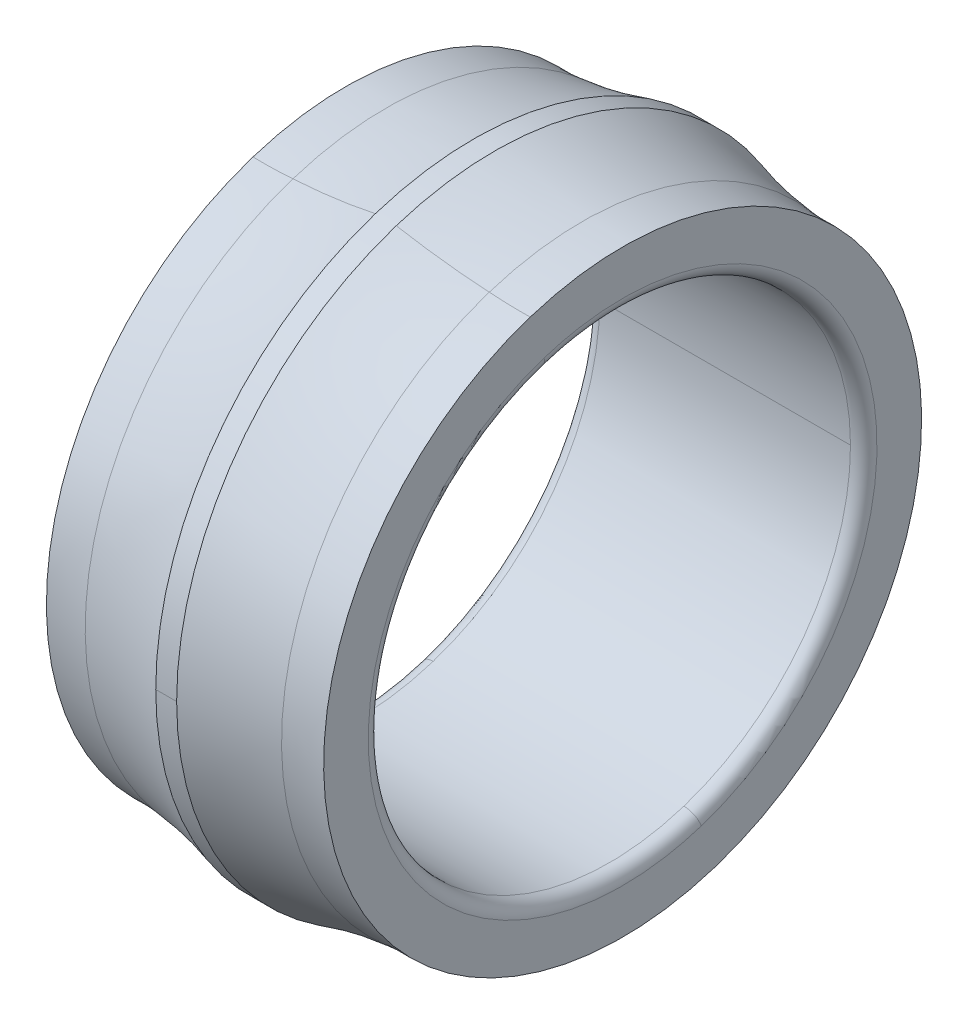
ISO-10303-21;
HEADER;
FILE_DESCRIPTION(('STEP AP214'),'2;1');
FILE_NAME('part.step','',(''),(''),'','','');
FILE_SCHEMA(('AUTOMOTIVE_DESIGN { 1 0 10303 214 1 1 1 1 }'));
ENDSEC;
DATA;
#1=APPLICATION_CONTEXT('core data for automotive mechanical design processes');
#2=APPLICATION_PROTOCOL_DEFINITION('international standard','automotive_design',2000,#1);
#3=PRODUCT_CONTEXT('',#1,'mechanical');
#4=PRODUCT('Part','Part','',(#3));
#5=PRODUCT_RELATED_PRODUCT_CATEGORY('part','',(#4));
#6=PRODUCT_DEFINITION_FORMATION('','',#4);
#7=PRODUCT_DEFINITION_CONTEXT('part definition',#1,'design');
#8=PRODUCT_DEFINITION('design','',#6,#7);
#9=PRODUCT_DEFINITION_SHAPE('','',#8);
#10=(LENGTH_UNIT() NAMED_UNIT(*) SI_UNIT(.MILLI.,.METRE.));
#11=(NAMED_UNIT(*) PLANE_ANGLE_UNIT() SI_UNIT($,.RADIAN.));
#12=(NAMED_UNIT(*) SI_UNIT($,.STERADIAN.) SOLID_ANGLE_UNIT());
#13=UNCERTAINTY_MEASURE_WITH_UNIT(LENGTH_MEASURE(1.E-05),#10,'distance_accuracy_value','');
#14=(GEOMETRIC_REPRESENTATION_CONTEXT(3) GLOBAL_UNCERTAINTY_ASSIGNED_CONTEXT((#13)) GLOBAL_UNIT_ASSIGNED_CONTEXT((#10,
#11,#12)) REPRESENTATION_CONTEXT('',''));
#15=CARTESIAN_POINT('',(0.,0.,0.));
#16=DIRECTION('',(0.,0.,1.));
#17=DIRECTION('',(1.,0.,0.));
#18=AXIS2_PLACEMENT_3D('',#15,#16,#17);
#19=CARTESIAN_POINT('',(0.,24.8,0.));
#20=DIRECTION('',(-1.,0.,0.));
#21=DIRECTION('',(0.,0.,1.));
#22=AXIS2_PLACEMENT_3D('',#19,#20,#21);
#23=PLANE('',#22);
#24=CARTESIAN_POINT('',(0.,0.,0.));
#25=DIRECTION('',(1.,0.,0.));
#26=DIRECTION('',(0.,0.,-1.));
#27=AXIS2_PLACEMENT_3D('',#24,#25,#26);
#28=CIRCLE('',#27,21.1);
#29=CARTESIAN_POINT('',(0.,20.0672924938281,6.5202585813115));
#30=VERTEX_POINT('',#29);
#31=CARTESIAN_POINT('',(0.,-20.0672924938281,-6.52025858131149));
#32=VERTEX_POINT('',#31);
#33=EDGE_CURVE('E10',#30,#32,#28,.T.);
#34=ORIENTED_EDGE('',*,*,#33,.T.);
#35=CARTESIAN_POINT('',(0.,-20.0672924938277,-6.52025858131139));
#36=CARTESIAN_POINT('',(0.,-19.0430510718525,-9.67239202122012));
#37=CARTESIAN_POINT('',(0.,-17.4001446138765,-12.6236072896446));
#38=CARTESIAN_POINT('',(0.,-15.1900988574076,-15.2110989527053));
#39=CARTESIAN_POINT('',(0.,-9.87458804758288,-19.379962845858));
#40=CARTESIAN_POINT('',(0.,-3.37752322544457,-21.2299259970769));
#41=CARTESIAN_POINT('',(0.,0.014850120778391,-21.4969173544922));
#42=CARTESIAN_POINT('',(0.,6.72131360691236,-20.6860762361863));
#43=CARTESIAN_POINT('',(0.,12.6235569906424,-17.4001001484462));
#44=CARTESIAN_POINT('',(0.,15.2111110966231,-15.1901125797661));
#45=CARTESIAN_POINT('',(0.,19.3799658937177,-9.87458206582148));
#46=CARTESIAN_POINT('',(0.,21.2299077574398,-3.37752146660871));
#47=CARTESIAN_POINT('',(0.,21.4969828927928,0.0148355641550033));
#48=CARTESIAN_POINT('',(0.,21.0914413263433,3.36809505726355));
#49=CARTESIAN_POINT('',(0.,20.0672924938277,6.52025858131138));
#50=B_SPLINE_CURVE_WITH_KNOTS('',5,(#35,#36,#37,#38,#39,#40,#41,#42,#43,#44,#45,#46,#47,#48,
#49),.UNSPECIFIED.,.F.,.F.,(6,3,3,3,6),(0.,0.785398163397448,1.5707963267949,2.35619449019234,
3.14159265358979),.UNSPECIFIED.);
#51=EDGE_CURVE('E25',#32,#30,#50,.T.);
#52=ORIENTED_EDGE('',*,*,#51,.T.);
#53=EDGE_LOOP('',(#34,#52));
#54=FACE_BOUND('',#53,.T.);
#55=CARTESIAN_POINT('',(0.,0.,0.));
#56=DIRECTION('',(1.,0.,0.));
#57=DIRECTION('',(0.,0.,-1.));
#58=AXIS2_PLACEMENT_3D('',#55,#56,#57);
#59=CIRCLE('',#58,24.8);
#60=CARTESIAN_POINT('',(0.,23.5862016041198,7.66362146049869));
#61=VERTEX_POINT('',#60);
#62=CARTESIAN_POINT('',(0.,-23.5862016041198,-7.66362146049868));
#63=VERTEX_POINT('',#62);
#64=EDGE_CURVE('E367',#61,#63,#59,.T.);
#65=ORIENTED_EDGE('',*,*,#64,.F.);
#66=CARTESIAN_POINT('',(0.,0.,0.));
#67=DIRECTION('',(1.,0.,0.));
#68=DIRECTION('',(0.,-0.951056516295154,-0.309016994374947));
#69=AXIS2_PLACEMENT_3D('',#66,#67,#68);
#70=CIRCLE('',#69,24.8);
#71=EDGE_CURVE('E362',#63,#61,#70,.T.);
#72=ORIENTED_EDGE('',*,*,#71,.F.);
#73=EDGE_LOOP('',(#65,#72));
#74=FACE_BOUND('',#73,.T.);
#75=ADVANCED_FACE('F16',(#54,#74),#23,.T.);
#76=CARTESIAN_POINT('',(0.736800182850417,0.,0.));
#77=DIRECTION('',(1.,0.,0.));
#78=DIRECTION('',(0.,-0.309016994374947,0.951056516295154));
#79=AXIS2_PLACEMENT_3D('',#76,#77,#78);
#80=TOROIDAL_SURFACE('',#79,47.7881953507417,22.9999999998546);
#81=CARTESIAN_POINT('',(0.736800182850417,-45.4492745903087,-14.767364493889));
#82=DIRECTION('',(0.,0.309016994374947,-0.951056516295154));
#83=DIRECTION('',(-0.0320347905589147,0.950568390709873,0.308858392758054));
#84=AXIS2_PLACEMENT_3D('',#81,#82,#83);
#85=CIRCLE('',#84,22.9999999998546);
#86=CARTESIAN_POINT('',(3.35748315173578,-23.7174350584134,-7.70626179460336));
#87=VERTEX_POINT('',#86);
#88=EDGE_CURVE('E357',#63,#87,#85,.T.);
#89=ORIENTED_EDGE('',*,*,#88,.F.);
#90=ORIENTED_EDGE('',*,*,#71,.T.);
#91=CARTESIAN_POINT('',(0.736800182850417,45.4492745903087,14.767364493889));
#92=DIRECTION('',(0.,-0.309016994374947,0.951056516295154));
#93=DIRECTION('',(-0.0320347905589151,-0.950568390709873,-0.308858392758054));
#94=AXIS2_PLACEMENT_3D('',#91,#92,#93);
#95=CIRCLE('',#94,22.9999999998546);
#96=CARTESIAN_POINT('',(3.35748315173578,23.7174350584134,7.70626179460336));
#97=VERTEX_POINT('',#96);
#98=EDGE_CURVE('E353',#61,#97,#95,.T.);
#99=ORIENTED_EDGE('',*,*,#98,.T.);
#100=CARTESIAN_POINT('',(3.35748315173571,0.,0.));
#101=DIRECTION('',(1.,0.,0.));
#102=DIRECTION('',(0.,-0.951056516295154,-0.309016994374947));
#103=AXIS2_PLACEMENT_3D('',#100,#101,#102);
#104=CIRCLE('',#103,24.937987019746);
#105=EDGE_CURVE('E348',#87,#97,#104,.T.);
#106=ORIENTED_EDGE('',*,*,#105,.F.);
#107=EDGE_LOOP('',(#89,#90,#99,#106));
#108=FACE_BOUND('',#107,.T.);
#109=ADVANCED_FACE('F388',(#108),#80,.F.);
#110=CARTESIAN_POINT('',(0.122239074494067,0.,0.));
#111=DIRECTION('',(1.,0.,0.));
#112=DIRECTION('',(0.,-0.309016994374947,0.951056516295154));
#113=AXIS2_PLACEMENT_3D('',#110,#111,#112);
#114=TOROIDAL_SURFACE('',#113,60.7616960127302,35.9695000000465);
#115=CARTESIAN_POINT('',(0.122239074494067,-57.7878069340523,-18.7763966749781));
#116=DIRECTION('',(0.,0.309016994374947,-0.951056516295154));
#117=DIRECTION('',(0.0899440936692901,0.947201709103404,0.307764491593167));
#118=AXIS2_PLACEMENT_3D('',#115,#116,#117);
#119=CIRCLE('',#118,35.9695000000465);
#120=CARTESIAN_POINT('',(10.6330333657771,-25.0719032812416,-8.14635519812182));
#121=VERTEX_POINT('',#120);
#122=EDGE_CURVE('E343',#87,#121,#119,.T.);
#123=ORIENTED_EDGE('',*,*,#122,.F.);
#124=ORIENTED_EDGE('',*,*,#105,.T.);
#125=CARTESIAN_POINT('',(0.122239074494067,57.7878069340523,18.7763966749781));
#126=DIRECTION('',(0.,-0.309016994374947,0.951056516295154));
#127=DIRECTION('',(0.0899440936692892,-0.947201709103404,-0.307764491593168));
#128=AXIS2_PLACEMENT_3D('',#125,#126,#127);
#129=CIRCLE('',#128,35.9695000000465);
#130=CARTESIAN_POINT('',(10.633033365777,25.0719032812416,8.14635519812182));
#131=VERTEX_POINT('',#130);
#132=EDGE_CURVE('E339',#97,#131,#129,.T.);
#133=ORIENTED_EDGE('',*,*,#132,.T.);
#134=CARTESIAN_POINT('',(10.633033365777,0.,0.));
#135=DIRECTION('',(1.,0.,0.));
#136=DIRECTION('',(0.,0.,-1.));
#137=AXIS2_PLACEMENT_3D('',#134,#135,#136);
#138=CIRCLE('',#137,26.362159189981);
#139=CARTESIAN_POINT('',(10.633033365777,0.,-26.362159189981));
#140=VERTEX_POINT('',#139);
#141=EDGE_CURVE('E334',#140,#131,#138,.T.);
#142=ORIENTED_EDGE('',*,*,#141,.F.);
#143=CARTESIAN_POINT('',(10.633033365777,0.,0.));
#144=DIRECTION('',(1.,0.,0.));
#145=DIRECTION('',(0.,0.,-1.));
#146=AXIS2_PLACEMENT_3D('',#143,#144,#145);
#147=CIRCLE('',#146,26.362159189981);
#148=EDGE_CURVE('E329',#121,#140,#147,.T.);
#149=ORIENTED_EDGE('',*,*,#148,.F.);
#150=EDGE_LOOP('',(#123,#124,#133,#142,#149));
#151=FACE_BOUND('',#150,.T.);
#152=ADVANCED_FACE('F391',(#151),#114,.F.);
#153=CARTESIAN_POINT('',(23.,0.,0.));
#154=DIRECTION('',(1.,0.,0.));
#155=DIRECTION('',(0.,1.,0.));
#156=AXIS2_PLACEMENT_3D('',#153,#154,#155);
#157=CYLINDRICAL_SURFACE('',#156,26.362159189981);
#158=DIRECTION('',(1.,0.,0.));
#159=VECTOR('',#158,1.);
#160=CARTESIAN_POINT('',(10.633033365777,0.,26.362159189981));
#161=LINE('',#160,#159);
#162=CARTESIAN_POINT('',(10.633033365777,0.,26.362159189981));
#163=VERTEX_POINT('',#162);
#164=CARTESIAN_POINT('',(12.366966634222,0.,26.362159189981));
#165=VERTEX_POINT('',#164);
#166=EDGE_CURVE('E324',#163,#165,#161,.T.);
#167=ORIENTED_EDGE('',*,*,#166,.F.);
#168=CARTESIAN_POINT('',(10.633033365777,0.,0.));
#169=DIRECTION('',(1.,0.,0.));
#170=DIRECTION('',(0.,0.,-1.));
#171=AXIS2_PLACEMENT_3D('',#168,#169,#170);
#172=CIRCLE('',#171,26.362159189981);
#173=EDGE_CURVE('E319',#163,#121,#172,.T.);
#174=ORIENTED_EDGE('',*,*,#173,.T.);
#175=ORIENTED_EDGE('',*,*,#148,.T.);
#176=DIRECTION('',(1.,0.,0.));
#177=VECTOR('',#176,1.);
#178=CARTESIAN_POINT('',(10.633033365777,0.,-26.362159189981));
#179=LINE('',#178,#177);
#180=CARTESIAN_POINT('',(12.366966634222,0.,-26.362159189981));
#181=VERTEX_POINT('',#180);
#182=EDGE_CURVE('E315',#140,#181,#179,.T.);
#183=ORIENTED_EDGE('',*,*,#182,.T.);
#184=CARTESIAN_POINT('',(12.366966634222,0.,0.));
#185=DIRECTION('',(1.,0.,0.));
#186=DIRECTION('',(0.,0.,-1.));
#187=AXIS2_PLACEMENT_3D('',#184,#185,#186);
#188=CIRCLE('',#187,26.362159189981);
#189=CARTESIAN_POINT('',(12.3669666342221,-25.0719032812416,-8.14635519812182));
#190=VERTEX_POINT('',#189);
#191=EDGE_CURVE('E310',#190,#181,#188,.T.);
#192=ORIENTED_EDGE('',*,*,#191,.F.);
#193=CARTESIAN_POINT('',(12.366966634222,0.,0.));
#194=DIRECTION('',(1.,0.,0.));
#195=DIRECTION('',(0.,0.,-1.));
#196=AXIS2_PLACEMENT_3D('',#193,#194,#195);
#197=CIRCLE('',#196,26.362159189981);
#198=EDGE_CURVE('E305',#165,#190,#197,.T.);
#199=ORIENTED_EDGE('',*,*,#198,.F.);
#200=EDGE_LOOP('',(#167,#174,#175,#183,#192,#199));
#201=FACE_BOUND('',#200,.T.);
#202=ADVANCED_FACE('F402',(#201),#157,.T.);
#203=CARTESIAN_POINT('',(22.8777609255132,0.,0.));
#204=DIRECTION('',(1.,0.,0.));
#205=DIRECTION('',(0.,0.309016994374947,-0.951056516295154));
#206=AXIS2_PLACEMENT_3D('',#203,#204,#205);
#207=TOROIDAL_SURFACE('',#206,60.761696012774,35.9695000000908);
#208=CARTESIAN_POINT('',(22.8777609255132,-57.787806934094,-18.7763966749916));
#209=DIRECTION('',(0.,0.309016994374947,-0.951056516295154));
#210=DIRECTION('',(-0.292214078351509,0.909545688785494,0.295529308910132));
#211=AXIS2_PLACEMENT_3D('',#208,#209,#210);
#212=CIRCLE('',#211,35.9695000000908);
#213=CARTESIAN_POINT('',(19.642516848264,-23.7174350584134,-7.70626179460336));
#214=VERTEX_POINT('',#213);
#215=EDGE_CURVE('E301',#190,#214,#212,.T.);
#216=ORIENTED_EDGE('',*,*,#215,.T.);
#217=CARTESIAN_POINT('',(19.642516848264,0.,0.));
#218=DIRECTION('',(1.,0.,0.));
#219=DIRECTION('',(0.,0.,-1.));
#220=AXIS2_PLACEMENT_3D('',#217,#218,#219);
#221=CIRCLE('',#220,24.937987019746);
#222=CARTESIAN_POINT('',(19.642516848264,23.7174350584134,7.70626179460336));
#223=VERTEX_POINT('',#222);
#224=EDGE_CURVE('E296',#223,#214,#221,.T.);
#225=ORIENTED_EDGE('',*,*,#224,.F.);
#226=CARTESIAN_POINT('',(22.8777609255132,57.787806934094,18.7763966749916));
#227=DIRECTION('',(0.,-0.309016994374947,0.951056516295154));
#228=DIRECTION('',(-0.29221407835151,-0.909545688785493,-0.295529308910132));
#229=AXIS2_PLACEMENT_3D('',#226,#227,#228);
#230=CIRCLE('',#229,35.9695000000908);
#231=CARTESIAN_POINT('',(12.366966634222,25.0719032812416,8.14635519812182));
#232=VERTEX_POINT('',#231);
#233=EDGE_CURVE('E291',#232,#223,#230,.T.);
#234=ORIENTED_EDGE('',*,*,#233,.F.);
#235=CARTESIAN_POINT('',(12.366966634222,0.,0.));
#236=DIRECTION('',(1.,0.,0.));
#237=DIRECTION('',(0.,0.,-1.));
#238=AXIS2_PLACEMENT_3D('',#235,#236,#237);
#239=CIRCLE('',#238,26.362159189981);
#240=EDGE_CURVE('E286',#232,#165,#239,.T.);
#241=ORIENTED_EDGE('',*,*,#240,.T.);
#242=ORIENTED_EDGE('',*,*,#198,.T.);
#243=EDGE_LOOP('',(#216,#225,#234,#241,#242));
#244=FACE_BOUND('',#243,.T.);
#245=ADVANCED_FACE('F405',(#244),#207,.F.);
#246=CARTESIAN_POINT('',(23.,0.,0.));
#247=DIRECTION('',(1.,0.,0.));
#248=DIRECTION('',(0.,-1.,0.));
#249=AXIS2_PLACEMENT_3D('',#246,#247,#248);
#250=CYLINDRICAL_SURFACE('',#249,26.362159189981);
#251=ORIENTED_EDGE('',*,*,#166,.T.);
#252=ORIENTED_EDGE('',*,*,#240,.F.);
#253=CARTESIAN_POINT('',(12.366966634222,0.,0.));
#254=DIRECTION('',(1.,0.,0.));
#255=DIRECTION('',(0.,0.,-1.));
#256=AXIS2_PLACEMENT_3D('',#253,#254,#255);
#257=CIRCLE('',#256,26.362159189981);
#258=EDGE_CURVE('E281',#181,#232,#257,.T.);
#259=ORIENTED_EDGE('',*,*,#258,.F.);
#260=ORIENTED_EDGE('',*,*,#182,.F.);
#261=ORIENTED_EDGE('',*,*,#141,.T.);
#262=CARTESIAN_POINT('',(10.633033365777,0.,0.));
#263=DIRECTION('',(1.,0.,0.));
#264=DIRECTION('',(0.,0.,-1.));
#265=AXIS2_PLACEMENT_3D('',#262,#263,#264);
#266=CIRCLE('',#265,26.362159189981);
#267=EDGE_CURVE('E276',#131,#163,#266,.T.);
#268=ORIENTED_EDGE('',*,*,#267,.T.);
#269=EDGE_LOOP('',(#251,#252,#259,#260,#261,#268));
#270=FACE_BOUND('',#269,.T.);
#271=ADVANCED_FACE('F399',(#270),#250,.T.);
#272=CARTESIAN_POINT('',(0.122239074494067,0.,0.));
#273=DIRECTION('',(1.,0.,0.));
#274=DIRECTION('',(0.,0.309016994374947,-0.951056516295154));
#275=AXIS2_PLACEMENT_3D('',#272,#273,#274);
#276=TOROIDAL_SURFACE('',#275,60.7616960127302,35.9695000000465);
#277=ORIENTED_EDGE('',*,*,#122,.T.);
#278=ORIENTED_EDGE('',*,*,#173,.F.);
#279=ORIENTED_EDGE('',*,*,#267,.F.);
#280=ORIENTED_EDGE('',*,*,#132,.F.);
#281=CARTESIAN_POINT('',(3.35748315173571,0.,0.));
#282=DIRECTION('',(1.,0.,0.));
#283=DIRECTION('',(0.,0.,-1.));
#284=AXIS2_PLACEMENT_3D('',#281,#282,#283);
#285=CIRCLE('',#284,24.937987019746);
#286=EDGE_CURVE('E271',#97,#87,#285,.T.);
#287=ORIENTED_EDGE('',*,*,#286,.T.);
#288=EDGE_LOOP('',(#277,#278,#279,#280,#287));
#289=FACE_BOUND('',#288,.T.);
#290=ADVANCED_FACE('F396',(#289),#276,.F.);
#291=CARTESIAN_POINT('',(0.736800182850417,0.,0.));
#292=DIRECTION('',(1.,0.,0.));
#293=DIRECTION('',(0.,0.309016994374947,-0.951056516295154));
#294=AXIS2_PLACEMENT_3D('',#291,#292,#293);
#295=TOROIDAL_SURFACE('',#294,47.7881953507417,22.9999999998546);
#296=ORIENTED_EDGE('',*,*,#88,.T.);
#297=ORIENTED_EDGE('',*,*,#286,.F.);
#298=ORIENTED_EDGE('',*,*,#98,.F.);
#299=ORIENTED_EDGE('',*,*,#64,.T.);
#300=EDGE_LOOP('',(#296,#297,#298,#299));
#301=FACE_BOUND('',#300,.T.);
#302=ADVANCED_FACE('F384',(#301),#295,.F.);
#303=CARTESIAN_POINT('',(22.8777609255132,0.,0.));
#304=DIRECTION('',(1.,0.,0.));
#305=DIRECTION('',(0.,-0.309016994374947,0.951056516295154));
#306=AXIS2_PLACEMENT_3D('',#303,#304,#305);
#307=TOROIDAL_SURFACE('',#306,60.761696012774,35.9695000000908);
#308=ORIENTED_EDGE('',*,*,#215,.F.);
#309=ORIENTED_EDGE('',*,*,#191,.T.);
#310=ORIENTED_EDGE('',*,*,#258,.T.);
#311=ORIENTED_EDGE('',*,*,#233,.T.);
#312=CARTESIAN_POINT('',(19.642516848264,0.,0.));
#313=DIRECTION('',(1.,0.,0.));
#314=DIRECTION('',(0.,-0.951056516295154,-0.309016994374947));
#315=AXIS2_PLACEMENT_3D('',#312,#313,#314);
#316=CIRCLE('',#315,24.937987019746);
#317=EDGE_CURVE('E266',#214,#223,#316,.T.);
#318=ORIENTED_EDGE('',*,*,#317,.F.);
#319=EDGE_LOOP('',(#308,#309,#310,#311,#318));
#320=FACE_BOUND('',#319,.T.);
#321=ADVANCED_FACE('F409',(#320),#307,.F.);
#322=CARTESIAN_POINT('',(22.2631998171498,0.,0.));
#323=DIRECTION('',(1.,0.,0.));
#324=DIRECTION('',(0.,-0.309016994374947,0.951056516295154));
#325=AXIS2_PLACEMENT_3D('',#322,#323,#324);
#326=TOROIDAL_SURFACE('',#325,47.7881953507512,22.999999999864);
#327=CARTESIAN_POINT('',(22.2631998171498,-45.4492745903177,-14.767364493892));
#328=DIRECTION('',(0.,0.309016994374947,-0.951056516295154));
#329=DIRECTION('',(-0.113942737778313,0.94486258834925,0.307004465188276));
#330=AXIS2_PLACEMENT_3D('',#327,#328,#329);
#331=CIRCLE('',#330,22.9999999998641);
#332=CARTESIAN_POINT('',(23.,-23.5862016041198,-7.6636214604987));
#333=VERTEX_POINT('',#332);
#334=EDGE_CURVE('E261',#214,#333,#331,.T.);
#335=ORIENTED_EDGE('',*,*,#334,.F.);
#336=ORIENTED_EDGE('',*,*,#317,.T.);
#337=CARTESIAN_POINT('',(22.2631998171498,45.4492745903177,14.767364493892));
#338=DIRECTION('',(0.,-0.309016994374947,0.951056516295154));
#339=DIRECTION('',(-0.113942737778313,-0.94486258834925,-0.307004465188276));
#340=AXIS2_PLACEMENT_3D('',#337,#338,#339);
#341=CIRCLE('',#340,22.9999999998641);
#342=CARTESIAN_POINT('',(23.,23.5862016041198,7.6636214604987));
#343=VERTEX_POINT('',#342);
#344=EDGE_CURVE('E257',#223,#343,#341,.T.);
#345=ORIENTED_EDGE('',*,*,#344,.T.);
#346=CARTESIAN_POINT('',(23.,0.,0.));
#347=DIRECTION('',(1.,0.,0.));
#348=DIRECTION('',(0.,-0.951056516295154,-0.309016994374947));
#349=AXIS2_PLACEMENT_3D('',#346,#347,#348);
#350=CIRCLE('',#349,24.8);
#351=EDGE_CURVE('E252',#333,#343,#350,.T.);
#352=ORIENTED_EDGE('',*,*,#351,.F.);
#353=EDGE_LOOP('',(#335,#336,#345,#352));
#354=FACE_BOUND('',#353,.T.);
#355=ADVANCED_FACE('F413',(#354),#326,.F.);
#356=CARTESIAN_POINT('',(23.,21.1,0.));
#357=DIRECTION('',(1.,0.,0.));
#358=DIRECTION('',(0.,0.,-1.));
#359=AXIS2_PLACEMENT_3D('',#356,#357,#358);
#360=PLANE('',#359);
#361=CARTESIAN_POINT('',(23.,0.,0.));
#362=DIRECTION('',(1.,0.,0.));
#363=DIRECTION('',(0.,0.,-1.));
#364=AXIS2_PLACEMENT_3D('',#361,#362,#363);
#365=CIRCLE('',#364,24.8);
#366=EDGE_CURVE('E249',#343,#333,#365,.T.);
#367=ORIENTED_EDGE('',*,*,#366,.T.);
#368=ORIENTED_EDGE('',*,*,#351,.T.);
#369=EDGE_LOOP('',(#367,#368));
#370=FACE_BOUND('',#369,.T.);
#371=CARTESIAN_POINT('',(23.,-20.0672924938284,-6.52025858131164));
#372=CARTESIAN_POINT('',(23.,-19.9606118696683,-6.84861148160539));
#373=CARTESIAN_POINT('',(23.,-19.8458588268025,-7.17434083883172));
#374=CARTESIAN_POINT('',(23.,-19.6005144463527,-7.8197791952024));
#375=CARTESIAN_POINT('',(23.,-19.4699231087687,-8.13948819434676));
#376=CARTESIAN_POINT('',(23.,-19.1932086815757,-8.77211256260641));
#377=CARTESIAN_POINT('',(23.,-19.0470855919665,-9.0850279317217));
#378=CARTESIAN_POINT('',(23.,-18.7396618445937,-9.70331202064574));
#379=CARTESIAN_POINT('',(23.,-18.5783611868299,-10.0086807404545));
#380=CARTESIAN_POINT('',(23.,-18.2409703116433,-10.6111356507177));
#381=CARTESIAN_POINT('',(23.,-18.0648800942204,-10.9082218411722));
#382=CARTESIAN_POINT('',(23.,-17.6983344715934,-11.4933960450359));
#383=CARTESIAN_POINT('',(23.,-17.5078790663893,-11.781484058445));
#384=CARTESIAN_POINT('',(23.,-17.1130618503885,-12.347967863161));
#385=CARTESIAN_POINT('',(23.,-16.9087000395918,-12.6263636544679));
#386=CARTESIAN_POINT('',(23.,-16.4865623490452,-13.1727923393667));
#387=CARTESIAN_POINT('',(23.,-16.2687864692952,-13.4408252329587));
#388=CARTESIAN_POINT('',(23.,-15.8203452790271,-13.965882406576));
#389=CARTESIAN_POINT('',(23.,-15.589679968509,-14.2229066866013));
#390=CARTESIAN_POINT('',(23.,-15.1160156104411,-14.7253274393858));
#391=CARTESIAN_POINT('',(23.,-14.8730165628913,-14.9707239121451));
#392=CARTESIAN_POINT('',(23.,-14.3752701365355,-15.4492978687191));
#393=CARTESIAN_POINT('',(23.,-14.1205227577296,-15.6824753525338));
#394=CARTESIAN_POINT('',(23.,-13.5998933776677,-16.1360495862581));
#395=CARTESIAN_POINT('',(23.,-13.3340113764118,-16.3564463361677));
#396=CARTESIAN_POINT('',(23.,-12.7917532844641,-16.7839281470008));
#397=CARTESIAN_POINT('',(23.,-12.5153771937723,-16.9910132079244));
#398=CARTESIAN_POINT('',(23.,-11.9527967371673,-17.3913727547368));
#399=CARTESIAN_POINT('',(23.,-11.6665923712541,-17.5846472406256));
#400=CARTESIAN_POINT('',(23.,-11.0850448555909,-17.9569200222028));
#401=CARTESIAN_POINT('',(23.,-10.789701705841,-18.1359183178912));
#402=CARTESIAN_POINT('',(23.,-10.1905881300217,-18.4792074964948));
#403=CARTESIAN_POINT('',(23.,-9.88681770395224,-18.6434983794101));
#404=CARTESIAN_POINT('',(23.,-9.27158138505725,-18.9569769413403));
#405=CARTESIAN_POINT('',(23.,-8.96011549223172,-19.1061646203553));
#406=CARTESIAN_POINT('',(23.,-8.33023858844158,-19.3890773682991));
#407=CARTESIAN_POINT('',(23.,-8.01182757747698,-19.5228024372278));
#408=CARTESIAN_POINT('',(23.,-7.36882751742363,-19.774467809595));
#409=CARTESIAN_POINT('',(23.,-7.04423846833489,-19.8924081130335));
#410=CARTESIAN_POINT('',(23.,-6.38966429548315,-20.1122198258988));
#411=CARTESIAN_POINT('',(23.,-6.05967917172016,-20.2140912353257));
#412=CARTESIAN_POINT('',(23.,-5.39510781258636,-20.4015197430196));
#413=CARTESIAN_POINT('',(23.,-5.06052157721555,-20.4870768412867));
#414=CARTESIAN_POINT('',(23.,-4.38755404241341,-20.6416706121174));
#415=CARTESIAN_POINT('',(23.,-4.04917274298208,-20.710707284681));
#416=CARTESIAN_POINT('',(23.,-3.36943027024794,-20.8320938887138));
#417=CARTESIAN_POINT('',(23.,-3.02806909694513,-20.8844438201829));
#418=CARTESIAN_POINT('',(23.,-2.34318924543421,-20.9723308264563));
#419=CARTESIAN_POINT('',(23.,-1.9996705672261,-21.0078679012607));
#420=CARTESIAN_POINT('',(23.,-1.31130327248908,-21.0620435822787));
#421=CARTESIAN_POINT('',(23.,-0.966454655960164,-21.0806821884924));
#422=CARTESIAN_POINT('',(23.,-0.276258255103927,-21.1010160302943));
#423=CARTESIAN_POINT('',(23.,0.0690895292233964,-21.1027112658824));
#424=CARTESIAN_POINT('',(23.,0.759452292615127,-21.0891542824621));
#425=CARTESIAN_POINT('',(23.,1.10446727167954,-21.0739020634537));
#426=CARTESIAN_POINT('',(23.,1.79333325324111,-21.0264869147718));
#427=CARTESIAN_POINT('',(23.,2.13718425573829,-20.9943239850983));
#428=CARTESIAN_POINT('',(23.,2.82289391698259,-20.913164898401));
#429=CARTESIAN_POINT('',(23.,3.16475257572973,-20.8641687413772));
#430=CARTESIAN_POINT('',(23.,3.84565398202176,-20.7494612360131));
#431=CARTESIAN_POINT('',(23.,4.18469672956666,-20.6837498876728));
#432=CARTESIAN_POINT('',(23.,4.85914952977874,-20.5357703040694));
#433=CARTESIAN_POINT('',(23.,5.19455958244592,-20.4535020688064));
#434=CARTESIAN_POINT('',(23.,5.86093896070725,-20.2726069027423));
#435=CARTESIAN_POINT('',(23.,6.19190828630139,-20.1739799719411));
#436=CARTESIAN_POINT('',(23.,6.84860887632178,-19.9606050157157));
#437=CARTESIAN_POINT('',(23.,7.17434014074804,-19.8458569902915));
#438=CARTESIAN_POINT('',(23.,7.81977989328597,-19.6005162828638));
#439=CARTESIAN_POINT('',(23.,8.13948838139765,-19.4699236008604));
#440=CARTESIAN_POINT('',(23.,8.77211237555542,-19.193208189484));
#441=CARTESIAN_POINT('',(23.,9.0850278816015,-19.047085460111));
#442=CARTESIAN_POINT('',(23.,9.70331207076584,-18.7396619764493));
#443=CARTESIAN_POINT('',(23.,10.0086807538841,-18.5783612221606));
#444=CARTESIAN_POINT('',(23.,10.611135637288,-18.2409702763127));
#445=CARTESIAN_POINT('',(23.,10.9082218375737,-18.0648800847537));
#446=CARTESIAN_POINT('',(23.,11.4933960486343,-17.6983344810603));
#447=CARTESIAN_POINT('',(23.,11.7814840594092,-17.507879068926));
#448=CARTESIAN_POINT('',(23.,12.3479678621968,-17.1130618478519));
#449=CARTESIAN_POINT('',(23.,12.6263636542095,-16.9087000389121));
#450=CARTESIAN_POINT('',(23.,13.172792339625,-16.4865623497249));
#451=CARTESIAN_POINT('',(23.,13.4408252330279,-16.2687864694774));
#452=CARTESIAN_POINT('',(23.,13.9658824065067,-15.820345278845));
#453=CARTESIAN_POINT('',(23.,14.2229066865827,-15.5896799684602));
#454=CARTESIAN_POINT('',(23.,14.7253274394043,-15.1160156104899));
#455=CARTESIAN_POINT('',(23.,14.97072391215,-14.8730165629044));
#456=CARTESIAN_POINT('',(23.,15.4492978687141,-14.3752701365225));
#457=CARTESIAN_POINT('',(23.,15.6824753525325,-14.1205227577261));
#458=CARTESIAN_POINT('',(23.,16.1360495862594,-13.5998933776712));
#459=CARTESIAN_POINT('',(23.,16.356446336168,-13.3340113764127));
#460=CARTESIAN_POINT('',(23.,16.7839281470004,-12.7917532844632));
#461=CARTESIAN_POINT('',(23.,16.9910132079243,-12.5153771937721));
#462=CARTESIAN_POINT('',(23.,17.3913727547369,-11.9527967371676));
#463=CARTESIAN_POINT('',(23.,17.5846472406256,-11.6665923712542));
#464=CARTESIAN_POINT('',(23.,17.9569200222028,-11.0850448555909));
#465=CARTESIAN_POINT('',(23.,18.1359183178911,-10.7897017058411));
#466=CARTESIAN_POINT('',(23.,18.4792074964948,-10.1905881300218));
#467=CARTESIAN_POINT('',(23.,18.64349837941,-9.8868177039523));
#468=CARTESIAN_POINT('',(23.,18.9569769413403,-9.27158138505731));
#469=CARTESIAN_POINT('',(23.,19.1061646203553,-8.96011549223178));
#470=CARTESIAN_POINT('',(23.,19.3890773682991,-8.33023858844163));
#471=CARTESIAN_POINT('',(23.,19.5228024372279,-8.01182757747702));
#472=CARTESIAN_POINT('',(23.,19.7744678095949,-7.36882751742371));
#473=CARTESIAN_POINT('',(23.,19.8924081130332,-7.04423846833501));
#474=CARTESIAN_POINT('',(23.,20.112219825899,-6.38966429548313));
#475=CARTESIAN_POINT('',(23.,20.2140912353266,-6.05967917171995));
#476=CARTESIAN_POINT('',(23.,20.4015197430186,-5.39510781258668));
#477=CARTESIAN_POINT('',(23.,20.487076841283,-5.06052157721658));
#478=CARTESIAN_POINT('',(23.,20.641670612121,-4.38755404241248));
#479=CARTESIAN_POINT('',(23.,20.7107072846945,-4.04917274297847));
#480=CARTESIAN_POINT('',(23.,20.8320938887003,-3.36943027025166));
#481=CARTESIAN_POINT('',(23.,20.8844438201325,-3.02806909695886));
#482=CARTESIAN_POINT('',(23.,20.9723308265067,-2.34318924542059));
#483=CARTESIAN_POINT('',(23.,21.0078679014487,-1.99967056717512));
#484=CARTESIAN_POINT('',(23.,21.0620435820907,-1.31130327254019));
#485=CARTESIAN_POINT('',(23.,21.0806821877907,-0.96645465615073));
#486=CARTESIAN_POINT('',(23.,21.101016030996,-0.276258254913507));
#487=CARTESIAN_POINT('',(23.,21.1027112685013,0.0690895299342561));
#488=CARTESIAN_POINT('',(23.,21.0891542798432,0.759452291904127));
#489=CARTESIAN_POINT('',(23.,21.0739020536798,1.10446726902623));
#490=CARTESIAN_POINT('',(23.,21.0264869245457,1.79333325589428));
#491=CARTESIAN_POINT('',(23.,20.9943240215751,2.13718426564021));
#492=CARTESIAN_POINT('',(23.,20.9131648619242,2.82289390708056));
#493=CARTESIAN_POINT('',(23.,20.8641686052439,3.16475253877498));
#494=CARTESIAN_POINT('',(23.,20.7494613721464,3.84565401897642));
#495=CARTESIAN_POINT('',(23.,20.6837503957291,4.18469686748344));
#496=CARTESIAN_POINT('',(23.,20.5357697960131,4.85914939186186));
#497=CARTESIAN_POINT('',(23.,20.4535001727145,5.19455906773327));
#498=CARTESIAN_POINT('',(23.,20.2726087988342,5.86093947541979));
#499=CARTESIAN_POINT('',(23.,20.1739870482525,6.1919102072349));
#500=CARTESIAN_POINT('',(23.,20.0672924938284,6.52025858131153));
#501=B_SPLINE_CURVE_WITH_KNOTS('',3,(#371,#372,#373,#374,#375,#376,#377,#378,#379,#380,#381,
#382,#383,#384,#385,#386,#387,#388,#389,#390,#391,#392,#393,#394,#395,#396,#397,#398,#399,#400,
#401,#402,#403,#404,#405,#406,#407,#408,#409,#410,#411,#412,#413,#414,#415,#416,#417,#418,#419,
#420,#421,#422,#423,#424,#425,#426,#427,#428,#429,#430,#431,#432,#433,#434,#435,#436,#437,#438,
#439,#440,#441,#442,#443,#444,#445,#446,#447,#448,#449,#450,#451,#452,#453,#454,#455,#456,#457,
#458,#459,#460,#461,#462,#463,#464,#465,#466,#467,#468,#469,#470,#471,#472,#473,#474,#475,#476,
#477,#478,#479,#480,#481,#482,#483,#484,#485,#486,#487,#488,#489,#490,#491,#492,#493,#494,#495,
#496,#497,#498,#499,#500),.UNSPECIFIED.,.F.,.F.,(4,2,2,2,2,2,2,2,2,2,2,2,2,2,2,2,2,2,2,2,2,2,2,
2,2,2,2,2,2,2,2,2,2,2,2,2,2,2,2,2,2,2,2,2,2,2,2,2,2,2,2,2,2,2,2,2,2,2,2,2,2,2,2,2,4),(0.,
1.03563984366693,2.07127968733386,3.10691953100079,4.14255937466772,5.17819921833465,
6.21383906200158,7.24947890566851,8.28511874933545,9.32075859300238,10.3563984366693,
11.3920382803362,12.4276781240032,13.4633179676701,14.498957811337,15.534597655004,
16.5702374986709,17.6058773423378,18.6415171860048,19.6771570296717,20.7127968733386,
21.7484367170055,22.7840765606725,23.8197164043394,24.8553562480063,25.8909960916733,
26.9266359353402,27.9622757790071,28.9979156226741,30.033555466341,31.0691953100079,
32.1048351536749,33.1404749973418,34.1761148410087,35.2117546846757,36.2473945283426,
37.2830343720095,38.3186742156765,39.3543140593434,40.3899539030103,41.4255937466773,
42.4612335903442,43.4968734340111,44.532513277678,45.568153121345,46.6037929650119,
47.6394328086788,48.6750726523458,49.7107124960127,50.7463523396796,51.7819921833466,
52.8176320270135,53.8532718706804,54.8889117143474,55.9245515580143,56.9601914016812,
57.9958312453481,59.0314710890151,60.067110932682,61.1027507763489,62.1383906200159,
63.1740304636828,64.2096703073497,65.2453101510167,66.2809499946836),.UNSPECIFIED.);
#502=CARTESIAN_POINT('',(23.,-20.0672924938284,-6.5202585813116));
#503=VERTEX_POINT('',#502);
#504=CARTESIAN_POINT('',(23.,20.0672924938284,6.52025858131161));
#505=VERTEX_POINT('',#504);
#506=EDGE_CURVE('E248',#503,#505,#501,.T.);
#507=ORIENTED_EDGE('',*,*,#506,.F.);
#508=CARTESIAN_POINT('',(23.,20.0672924938284,6.52025858131165));
#509=CARTESIAN_POINT('',(23.,19.9606118696683,6.8486114816054));
#510=CARTESIAN_POINT('',(23.,19.8458588268025,7.17434083883172));
#511=CARTESIAN_POINT('',(23.,19.6005144463527,7.8197791952024));
#512=CARTESIAN_POINT('',(23.,19.4699231087687,8.13948819434676));
#513=CARTESIAN_POINT('',(23.,19.1932086815757,8.77211256260641));
#514=CARTESIAN_POINT('',(23.,19.0470855919665,9.0850279317217));
#515=CARTESIAN_POINT('',(23.,18.7396618445937,9.70331202064574));
#516=CARTESIAN_POINT('',(23.,18.5783611868299,10.0086807404545));
#517=CARTESIAN_POINT('',(23.,18.2409703116433,10.6111356507177));
#518=CARTESIAN_POINT('',(23.,18.0648800942204,10.9082218411722));
#519=CARTESIAN_POINT('',(23.,17.6983344715934,11.4933960450359));
#520=CARTESIAN_POINT('',(23.,17.5078790663893,11.7814840584451));
#521=CARTESIAN_POINT('',(23.,17.1130618503885,12.347967863161));
#522=CARTESIAN_POINT('',(23.,16.9087000395918,12.6263636544679));
#523=CARTESIAN_POINT('',(23.,16.4865623490451,13.1727923393667));
#524=CARTESIAN_POINT('',(23.,16.2687864692952,13.4408252329587));
#525=CARTESIAN_POINT('',(23.,15.8203452790271,13.965882406576));
#526=CARTESIAN_POINT('',(23.,15.589679968509,14.2229066866013));
#527=CARTESIAN_POINT('',(23.,15.116015610441,14.7253274393858));
#528=CARTESIAN_POINT('',(23.,14.8730165628913,14.9707239121451));
#529=CARTESIAN_POINT('',(23.,14.3752701365355,15.4492978687191));
#530=CARTESIAN_POINT('',(23.,14.1205227577295,15.6824753525338));
#531=CARTESIAN_POINT('',(23.,13.5998933776677,16.1360495862581));
#532=CARTESIAN_POINT('',(23.,13.3340113764117,16.3564463361677));
#533=CARTESIAN_POINT('',(23.,12.7917532844641,16.7839281470009));
#534=CARTESIAN_POINT('',(23.,12.5153771937723,16.9910132079244));
#535=CARTESIAN_POINT('',(23.,11.9527967371673,17.3913727547368));
#536=CARTESIAN_POINT('',(23.,11.666592371254,17.5846472406257));
#537=CARTESIAN_POINT('',(23.,11.0850448555909,17.9569200222028));
#538=CARTESIAN_POINT('',(23.,10.789701705841,18.1359183178912));
#539=CARTESIAN_POINT('',(23.,10.1905881300217,18.4792074964948));
#540=CARTESIAN_POINT('',(23.,9.88681770395223,18.6434983794101));
#541=CARTESIAN_POINT('',(23.,9.27158138505725,18.9569769413403));
#542=CARTESIAN_POINT('',(23.,8.96011549223171,19.1061646203553));
#543=CARTESIAN_POINT('',(23.,8.33023858844157,19.3890773682991));
#544=CARTESIAN_POINT('',(23.,8.01182757747697,19.5228024372278));
#545=CARTESIAN_POINT('',(23.,7.36882751742362,19.774467809595));
#546=CARTESIAN_POINT('',(23.,7.04423846833487,19.8924081130335));
#547=CARTESIAN_POINT('',(23.,6.38966429548313,20.1122198258988));
#548=CARTESIAN_POINT('',(23.,6.05967917172014,20.2140912353257));
#549=CARTESIAN_POINT('',(23.,5.39510781258634,20.4015197430196));
#550=CARTESIAN_POINT('',(23.,5.06052157721553,20.4870768412867));
#551=CARTESIAN_POINT('',(23.,4.38755404241338,20.6416706121174));
#552=CARTESIAN_POINT('',(23.,4.04917274298205,20.710707284681));
#553=CARTESIAN_POINT('',(23.,3.3694302702479,20.8320938887138));
#554=CARTESIAN_POINT('',(23.,3.02806909694509,20.8844438201829));
#555=CARTESIAN_POINT('',(23.,2.34318924543417,20.9723308264563));
#556=CARTESIAN_POINT('',(23.,1.99967056722607,21.0078679012607));
#557=CARTESIAN_POINT('',(23.,1.31130327248905,21.0620435822787));
#558=CARTESIAN_POINT('',(23.,0.966454655960141,21.0806821884924));
#559=CARTESIAN_POINT('',(23.,0.276258255103904,21.1010160302943));
#560=CARTESIAN_POINT('',(23.,-0.0690895292234226,21.1027112658824));
#561=CARTESIAN_POINT('',(23.,-0.759452292615154,21.0891542824621));
#562=CARTESIAN_POINT('',(23.,-1.10446727167956,21.0739020634537));
#563=CARTESIAN_POINT('',(23.,-1.79333325324114,21.0264869147718));
#564=CARTESIAN_POINT('',(23.,-2.13718425573831,20.9943239850983));
#565=CARTESIAN_POINT('',(23.,-2.82289391698262,20.913164898401));
#566=CARTESIAN_POINT('',(23.,-3.16475257572976,20.8641687413772));
#567=CARTESIAN_POINT('',(23.,-3.84565398202179,20.7494612360131));
#568=CARTESIAN_POINT('',(23.,-4.18469672956669,20.6837498876728));
#569=CARTESIAN_POINT('',(23.,-4.85914952977878,20.5357703040694));
#570=CARTESIAN_POINT('',(23.,-5.19455958244596,20.4535020688064));
#571=CARTESIAN_POINT('',(23.,-5.86093896070728,20.2726069027422));
#572=CARTESIAN_POINT('',(23.,-6.19190828630142,20.1739799719411));
#573=CARTESIAN_POINT('',(23.,-6.84860887632181,19.9606050157157));
#574=CARTESIAN_POINT('',(23.,-7.17434014074807,19.8458569902914));
#575=CARTESIAN_POINT('',(23.,-7.81977989328601,19.6005162828638));
#576=CARTESIAN_POINT('',(23.,-8.13948838139769,19.4699236008604));
#577=CARTESIAN_POINT('',(23.,-8.77211237555544,19.193208189484));
#578=CARTESIAN_POINT('',(23.,-9.08502788160152,19.047085460111));
#579=CARTESIAN_POINT('',(23.,-9.70331207076587,18.7396619764493));
#580=CARTESIAN_POINT('',(23.,-10.0086807538841,18.5783612221605));
#581=CARTESIAN_POINT('',(23.,-10.6111356372881,18.2409702763127));
#582=CARTESIAN_POINT('',(23.,-10.9082218375737,18.0648800847536));
#583=CARTESIAN_POINT('',(23.,-11.4933960486343,17.6983344810603));
#584=CARTESIAN_POINT('',(23.,-11.7814840594092,17.5078790689259));
#585=CARTESIAN_POINT('',(23.,-12.3479678621968,17.1130618478519));
#586=CARTESIAN_POINT('',(23.,-12.6263636542095,16.9087000389121));
#587=CARTESIAN_POINT('',(23.,-13.172792339625,16.4865623497249));
#588=CARTESIAN_POINT('',(23.,-13.4408252330279,16.2687864694773));
#589=CARTESIAN_POINT('',(23.,-13.9658824065068,15.820345278845));
#590=CARTESIAN_POINT('',(23.,-14.2229066865827,15.5896799684602));
#591=CARTESIAN_POINT('',(23.,-14.7253274394044,15.1160156104899));
#592=CARTESIAN_POINT('',(23.,-14.9707239121501,14.8730165629044));
#593=CARTESIAN_POINT('',(23.,-15.4492978687141,14.3752701365225));
#594=CARTESIAN_POINT('',(23.,-15.6824753525325,14.1205227577261));
#595=CARTESIAN_POINT('',(23.,-16.1360495862595,13.5998933776712));
#596=CARTESIAN_POINT('',(23.,-16.3564463361681,13.3340113764127));
#597=CARTESIAN_POINT('',(23.,-16.7839281470005,12.7917532844632));
#598=CARTESIAN_POINT('',(23.,-16.9910132079243,12.5153771937721));
#599=CARTESIAN_POINT('',(23.,-17.3913727547369,11.9527967371676));
#600=CARTESIAN_POINT('',(23.,-17.5846472406257,11.6665923712541));
#601=CARTESIAN_POINT('',(23.,-17.9569200222028,11.0850448555908));
#602=CARTESIAN_POINT('',(23.,-18.1359183178912,10.789701705841));
#603=CARTESIAN_POINT('',(23.,-18.4792074964948,10.1905881300217));
#604=CARTESIAN_POINT('',(23.,-18.6434983794101,9.88681770395225));
#605=CARTESIAN_POINT('',(23.,-18.9569769413403,9.27158138505726));
#606=CARTESIAN_POINT('',(23.,-19.1061646203553,8.96011549223174));
#607=CARTESIAN_POINT('',(23.,-19.3890773682991,8.3302385884416));
#608=CARTESIAN_POINT('',(23.,-19.5228024372279,8.01182757747698));
#609=CARTESIAN_POINT('',(23.,-19.7744678095949,7.36882751742367));
#610=CARTESIAN_POINT('',(23.,-19.8924081130332,7.04423846833498));
#611=CARTESIAN_POINT('',(23.,-20.1122198258991,6.38966429548309));
#612=CARTESIAN_POINT('',(23.,-20.2140912353266,6.0596791717199));
#613=CARTESIAN_POINT('',(23.,-20.4015197430186,5.39510781258662));
#614=CARTESIAN_POINT('',(23.,-20.4870768412831,5.06052157721653));
#615=CARTESIAN_POINT('',(23.,-20.641670612121,4.38755404241243));
#616=CARTESIAN_POINT('',(23.,-20.7107072846945,4.04917274297842));
#617=CARTESIAN_POINT('',(23.,-20.8320938887003,3.3694302702516));
#618=CARTESIAN_POINT('',(23.,-20.8844438201325,3.0280690969588));
#619=CARTESIAN_POINT('',(23.,-20.9723308265067,2.34318924542053));
#620=CARTESIAN_POINT('',(23.,-21.0078679014487,1.99967056717506));
#621=CARTESIAN_POINT('',(23.,-21.0620435820907,1.31130327254013));
#622=CARTESIAN_POINT('',(23.,-21.0806821877907,0.966454656150672));
#623=CARTESIAN_POINT('',(23.,-21.101016030996,0.276258254913449));
#624=CARTESIAN_POINT('',(23.,-21.1027112685013,-0.0690895299343147));
#625=CARTESIAN_POINT('',(23.,-21.0891542798432,-0.759452291904185));
#626=CARTESIAN_POINT('',(23.,-21.0739020536798,-1.10446726902629));
#627=CARTESIAN_POINT('',(23.,-21.0264869245457,-1.79333325589433));
#628=CARTESIAN_POINT('',(23.,-20.9943240215751,-2.13718426564027));
#629=CARTESIAN_POINT('',(23.,-20.9131648619242,-2.82289390708062));
#630=CARTESIAN_POINT('',(23.,-20.8641686052439,-3.16475253877504));
#631=CARTESIAN_POINT('',(23.,-20.7494613721464,-3.84565401897647));
#632=CARTESIAN_POINT('',(23.,-20.6837503957291,-4.18469686748349));
#633=CARTESIAN_POINT('',(23.,-20.5357697960131,-4.85914939186192));
#634=CARTESIAN_POINT('',(23.,-20.4535001727145,-5.19455906773333));
#635=CARTESIAN_POINT('',(23.,-20.2726087988342,-5.86093947541985));
#636=CARTESIAN_POINT('',(23.,-20.1739870482525,-6.19191020723496));
#637=CARTESIAN_POINT('',(23.,-20.0672924938284,-6.52025858131159));
#638=B_SPLINE_CURVE_WITH_KNOTS('',3,(#508,#509,#510,#511,#512,#513,#514,#515,#516,#517,#518,
#519,#520,#521,#522,#523,#524,#525,#526,#527,#528,#529,#530,#531,#532,#533,#534,#535,#536,#537,
#538,#539,#540,#541,#542,#543,#544,#545,#546,#547,#548,#549,#550,#551,#552,#553,#554,#555,#556,
#557,#558,#559,#560,#561,#562,#563,#564,#565,#566,#567,#568,#569,#570,#571,#572,#573,#574,#575,
#576,#577,#578,#579,#580,#581,#582,#583,#584,#585,#586,#587,#588,#589,#590,#591,#592,#593,#594,
#595,#596,#597,#598,#599,#600,#601,#602,#603,#604,#605,#606,#607,#608,#609,#610,#611,#612,#613,
#614,#615,#616,#617,#618,#619,#620,#621,#622,#623,#624,#625,#626,#627,#628,#629,#630,#631,#632,
#633,#634,#635,#636,#637),.UNSPECIFIED.,.F.,.F.,(4,2,2,2,2,2,2,2,2,2,2,2,2,2,2,2,2,2,2,2,2,2,2,
2,2,2,2,2,2,2,2,2,2,2,2,2,2,2,2,2,2,2,2,2,2,2,2,2,2,2,2,2,2,2,2,2,2,2,2,2,2,2,2,2,4),(0.,
1.03563984366693,2.07127968733386,3.10691953100079,4.14255937466773,5.17819921833466,
6.21383906200159,7.24947890566852,8.28511874933546,9.32075859300238,10.3563984366693,
11.3920382803363,12.4276781240032,13.4633179676701,14.498957811337,15.534597655004,
16.5702374986709,17.6058773423378,18.6415171860048,19.6771570296717,20.7127968733386,
21.7484367170056,22.7840765606725,23.8197164043394,24.8553562480064,25.8909960916733,
26.9266359353402,27.9622757790072,28.9979156226741,30.033555466341,31.069195310008,
32.1048351536749,33.1404749973418,34.1761148410088,35.2117546846757,36.2473945283426,
37.2830343720095,38.3186742156765,39.3543140593434,40.3899539030104,41.4255937466773,
42.4612335903442,43.4968734340111,44.5325132776781,45.568153121345,46.6037929650119,
47.6394328086789,48.6750726523458,49.7107124960127,50.7463523396797,51.7819921833466,
52.8176320270135,53.8532718706805,54.8889117143474,55.9245515580143,56.9601914016813,
57.9958312453482,59.0314710890151,60.067110932682,61.102750776349,62.1383906200159,
63.1740304636828,64.2096703073498,65.2453101510167,66.2809499946837),.UNSPECIFIED.);
#639=EDGE_CURVE('E211',#505,#503,#638,.T.);
#640=ORIENTED_EDGE('',*,*,#639,.F.);
#641=EDGE_LOOP('',(#507,#640));
#642=FACE_BOUND('',#641,.T.);
#643=ADVANCED_FACE('F196',(#370,#642),#360,.T.);
#644=CARTESIAN_POINT('',(21.8999999999993,0.,0.));
#645=DIRECTION('',(1.,0.,0.));
#646=DIRECTION('',(0.,0.309016994374947,-0.951056516295154));
#647=AXIS2_PLACEMENT_3D('',#644,#645,#646);
#648=TOROIDAL_SURFACE('',#647,21.1000000000007,1.10000000000069);
#649=CARTESIAN_POINT('',(21.8999999999993,-20.0672924938284,-6.5202585813116));
#650=DIRECTION('',(0.,0.309016994374948,-0.951056516295154));
#651=DIRECTION('',(6.3948846218369E-13,0.951056516295154,0.309016994374948));
#652=AXIS2_PLACEMENT_3D('',#649,#650,#651);
#653=CIRCLE('',#652,1.10000000000069);
#654=CARTESIAN_POINT('',(21.9,-19.0211303259031,-6.18033988749895));
#655=VERTEX_POINT('',#654);
#656=EDGE_CURVE('E222',#655,#503,#653,.T.);
#657=ORIENTED_EDGE('',*,*,#656,.F.);
#658=CARTESIAN_POINT('',(21.9,0.,0.));
#659=DIRECTION('',(1.,0.,0.));
#660=DIRECTION('',(0.,0.,-1.));
#661=AXIS2_PLACEMENT_3D('',#658,#659,#660);
#662=CIRCLE('',#661,20.);
#663=CARTESIAN_POINT('',(21.9,0.,20.));
#664=VERTEX_POINT('',#663);
#665=EDGE_CURVE('E217',#664,#655,#662,.T.);
#666=ORIENTED_EDGE('',*,*,#665,.F.);
#667=CARTESIAN_POINT('',(21.9,0.,0.));
#668=DIRECTION('',(1.,0.,0.));
#669=DIRECTION('',(0.,0.,-1.));
#670=AXIS2_PLACEMENT_3D('',#667,#668,#669);
#671=CIRCLE('',#670,20.);
#672=CARTESIAN_POINT('',(21.9,19.0211303259031,6.18033988749895));
#673=VERTEX_POINT('',#672);
#674=EDGE_CURVE('E213',#673,#664,#671,.T.);
#675=ORIENTED_EDGE('',*,*,#674,.F.);
#676=CARTESIAN_POINT('',(21.8999999999993,20.0672924938284,6.52025858131161));
#677=DIRECTION('',(0.,-0.309016994374948,0.951056516295154));
#678=DIRECTION('',(6.36258722475691E-13,-0.951056516295154,-0.309016994374948));
#679=AXIS2_PLACEMENT_3D('',#676,#677,#678);
#680=CIRCLE('',#679,1.10000000000069);
#681=EDGE_CURVE('E170',#673,#505,#680,.T.);
#682=ORIENTED_EDGE('',*,*,#681,.T.);
#683=ORIENTED_EDGE('',*,*,#639,.T.);
#684=EDGE_LOOP('',(#657,#666,#675,#682,#683));
#685=FACE_BOUND('',#684,.T.);
#686=ADVANCED_FACE('F190',(#685),#648,.T.);
#687=CARTESIAN_POINT('',(21.8999999999993,0.,0.));
#688=DIRECTION('',(1.,0.,0.));
#689=DIRECTION('',(0.,-0.309016994374947,0.951056516295154));
#690=AXIS2_PLACEMENT_3D('',#687,#688,#689);
#691=TOROIDAL_SURFACE('',#690,21.1000000000007,1.10000000000069);
#692=ORIENTED_EDGE('',*,*,#656,.T.);
#693=ORIENTED_EDGE('',*,*,#506,.T.);
#694=ORIENTED_EDGE('',*,*,#681,.F.);
#695=CARTESIAN_POINT('',(21.9,0.,0.));
#696=DIRECTION('',(1.,0.,0.));
#697=DIRECTION('',(0.,0.,-1.));
#698=AXIS2_PLACEMENT_3D('',#695,#696,#697);
#699=CIRCLE('',#698,20.);
#700=CARTESIAN_POINT('',(21.9,0.,-20.));
#701=VERTEX_POINT('',#700);
#702=EDGE_CURVE('E165',#701,#673,#699,.T.);
#703=ORIENTED_EDGE('',*,*,#702,.F.);
#704=CARTESIAN_POINT('',(21.9,0.,0.));
#705=DIRECTION('',(1.,0.,0.));
#706=DIRECTION('',(0.,0.,-1.));
#707=AXIS2_PLACEMENT_3D('',#704,#705,#706);
#708=CIRCLE('',#707,20.);
#709=EDGE_CURVE('E160',#655,#701,#708,.T.);
#710=ORIENTED_EDGE('',*,*,#709,.F.);
#711=EDGE_LOOP('',(#692,#693,#694,#703,#710));
#712=FACE_BOUND('',#711,.T.);
#713=ADVANCED_FACE('F179',(#712),#691,.T.);
#714=CARTESIAN_POINT('',(23.,0.,0.));
#715=DIRECTION('',(1.,0.,0.));
#716=DIRECTION('',(0.,1.,0.));
#717=AXIS2_PLACEMENT_3D('',#714,#715,#716);
#718=CYLINDRICAL_SURFACE('',#717,20.);
#719=DIRECTION('',(1.,0.,0.));
#720=VECTOR('',#719,1.);
#721=CARTESIAN_POINT('',(1.1,0.,20.));
#722=LINE('',#721,#720);
#723=CARTESIAN_POINT('',(1.1,0.,20.));
#724=VERTEX_POINT('',#723);
#725=EDGE_CURVE('E136',#724,#664,#722,.T.);
#726=ORIENTED_EDGE('',*,*,#725,.T.);
#727=ORIENTED_EDGE('',*,*,#665,.T.);
#728=ORIENTED_EDGE('',*,*,#709,.T.);
#729=DIRECTION('',(1.,0.,0.));
#730=VECTOR('',#729,1.);
#731=CARTESIAN_POINT('',(1.1,0.,-20.));
#732=LINE('',#731,#730);
#733=CARTESIAN_POINT('',(1.1,0.,-20.));
#734=VERTEX_POINT('',#733);
#735=EDGE_CURVE('E153',#734,#701,#732,.T.);
#736=ORIENTED_EDGE('',*,*,#735,.F.);
#737=CARTESIAN_POINT('',(1.1,0.,0.));
#738=DIRECTION('',(1.,0.,0.));
#739=DIRECTION('',(0.,0.,-1.));
#740=AXIS2_PLACEMENT_3D('',#737,#738,#739);
#741=CIRCLE('',#740,20.);
#742=CARTESIAN_POINT('',(1.1,-19.0211303259031,-6.18033988749894));
#743=VERTEX_POINT('',#742);
#744=EDGE_CURVE('E128',#743,#734,#741,.T.);
#745=ORIENTED_EDGE('',*,*,#744,.F.);
#746=CARTESIAN_POINT('',(1.1,0.,0.));
#747=DIRECTION('',(1.,0.,0.));
#748=DIRECTION('',(0.,0.,-1.));
#749=AXIS2_PLACEMENT_3D('',#746,#747,#748);
#750=CIRCLE('',#749,20.);
#751=EDGE_CURVE('E146',#724,#743,#750,.T.);
#752=ORIENTED_EDGE('',*,*,#751,.F.);
#753=EDGE_LOOP('',(#726,#727,#728,#736,#745,#752));
#754=FACE_BOUND('',#753,.T.);
#755=ADVANCED_FACE('F189',(#754),#718,.F.);
#756=CARTESIAN_POINT('',(1.10000000000035,0.,0.));
#757=DIRECTION('',(1.,0.,0.));
#758=DIRECTION('',(0.,0.309016994374947,-0.951056516295154));
#759=AXIS2_PLACEMENT_3D('',#756,#757,#758);
#760=TOROIDAL_SURFACE('',#759,21.1000000000003,1.10000000000035);
#761=CARTESIAN_POINT('',(1.10000000000035,-20.0672924938281,-6.52025858131149));
#762=DIRECTION('',(0.,0.309016994374947,-0.951056516295154));
#763=DIRECTION('',(-1.,0.,0.));
#764=AXIS2_PLACEMENT_3D('',#761,#762,#763);
#765=CIRCLE('',#764,1.10000000000035);
#766=EDGE_CURVE('E121',#32,#743,#765,.T.);
#767=ORIENTED_EDGE('',*,*,#766,.F.);
#768=ORIENTED_EDGE('',*,*,#33,.F.);
#769=CARTESIAN_POINT('',(1.10000000000035,20.0672924938281,6.5202585813115));
#770=DIRECTION('',(0.,-0.309016994374947,0.951056516295154));
#771=DIRECTION('',(-1.,0.,0.));
#772=AXIS2_PLACEMENT_3D('',#769,#770,#771);
#773=CIRCLE('',#772,1.10000000000035);
#774=CARTESIAN_POINT('',(1.1,19.0211303259031,6.18033988749895));
#775=VERTEX_POINT('',#774);
#776=EDGE_CURVE('E114',#30,#775,#773,.T.);
#777=ORIENTED_EDGE('',*,*,#776,.T.);
#778=CARTESIAN_POINT('',(1.1,0.,0.));
#779=DIRECTION('',(1.,0.,0.));
#780=DIRECTION('',(0.,0.,-1.));
#781=AXIS2_PLACEMENT_3D('',#778,#779,#780);
#782=CIRCLE('',#781,20.);
#783=EDGE_CURVE('E119',#775,#724,#782,.T.);
#784=ORIENTED_EDGE('',*,*,#783,.T.);
#785=ORIENTED_EDGE('',*,*,#751,.T.);
#786=EDGE_LOOP('',(#767,#768,#777,#784,#785));
#787=FACE_BOUND('',#786,.T.);
#788=ADVANCED_FACE('F116',(#787),#760,.T.);
#789=CARTESIAN_POINT('',(23.,0.,0.));
#790=DIRECTION('',(1.,0.,0.));
#791=DIRECTION('',(0.,-1.,0.));
#792=AXIS2_PLACEMENT_3D('',#789,#790,#791);
#793=CYLINDRICAL_SURFACE('',#792,20.);
#794=ORIENTED_EDGE('',*,*,#725,.F.);
#795=ORIENTED_EDGE('',*,*,#783,.F.);
#796=CARTESIAN_POINT('',(1.1,0.,0.));
#797=DIRECTION('',(1.,0.,0.));
#798=DIRECTION('',(0.,0.,-1.));
#799=AXIS2_PLACEMENT_3D('',#796,#797,#798);
#800=CIRCLE('',#799,20.);
#801=EDGE_CURVE('E125',#734,#775,#800,.T.);
#802=ORIENTED_EDGE('',*,*,#801,.F.);
#803=ORIENTED_EDGE('',*,*,#735,.T.);
#804=ORIENTED_EDGE('',*,*,#702,.T.);
#805=ORIENTED_EDGE('',*,*,#674,.T.);
#806=EDGE_LOOP('',(#794,#795,#802,#803,#804,#805));
#807=FACE_BOUND('',#806,.T.);
#808=ADVANCED_FACE('F133',(#807),#793,.F.);
#809=CARTESIAN_POINT('',(1.10000000000035,0.,0.));
#810=DIRECTION('',(1.,0.,0.));
#811=DIRECTION('',(0.,-0.309016994374947,0.951056516295154));
#812=AXIS2_PLACEMENT_3D('',#809,#810,#811);
#813=TOROIDAL_SURFACE('',#812,21.1000000000003,1.10000000000035);
#814=ORIENTED_EDGE('',*,*,#766,.T.);
#815=ORIENTED_EDGE('',*,*,#744,.T.);
#816=ORIENTED_EDGE('',*,*,#801,.T.);
#817=ORIENTED_EDGE('',*,*,#776,.F.);
#818=ORIENTED_EDGE('',*,*,#51,.F.);
#819=EDGE_LOOP('',(#814,#815,#816,#817,#818));
#820=FACE_BOUND('',#819,.T.);
#821=ADVANCED_FACE('F127',(#820),#813,.T.);
#822=CARTESIAN_POINT('',(22.2631998171498,0.,0.));
#823=DIRECTION('',(1.,0.,0.));
#824=DIRECTION('',(0.,0.309016994374947,-0.951056516295154));
#825=AXIS2_PLACEMENT_3D('',#822,#823,#824);
#826=TOROIDAL_SURFACE('',#825,47.7881953507512,22.999999999864);
#827=ORIENTED_EDGE('',*,*,#334,.T.);
#828=ORIENTED_EDGE('',*,*,#366,.F.);
#829=ORIENTED_EDGE('',*,*,#344,.F.);
#830=ORIENTED_EDGE('',*,*,#224,.T.);
#831=EDGE_LOOP('',(#827,#828,#829,#830));
#832=FACE_BOUND('',#831,.T.);
#833=ADVANCED_FACE('F416',(#832),#826,.F.);
#834=CLOSED_SHELL('',(#75,#109,#152,#202,#245,#271,#290,#302,#321,#355,#643,#686,#713,#755,#788,
#808,#821,#833));
#835=MANIFOLD_SOLID_BREP('B1',#834);
#836=ADVANCED_BREP_SHAPE_REPRESENTATION('',(#18,#835),#14);
#837=SHAPE_DEFINITION_REPRESENTATION(#9,#836);
ENDSEC;
END-ISO-10303-21;
